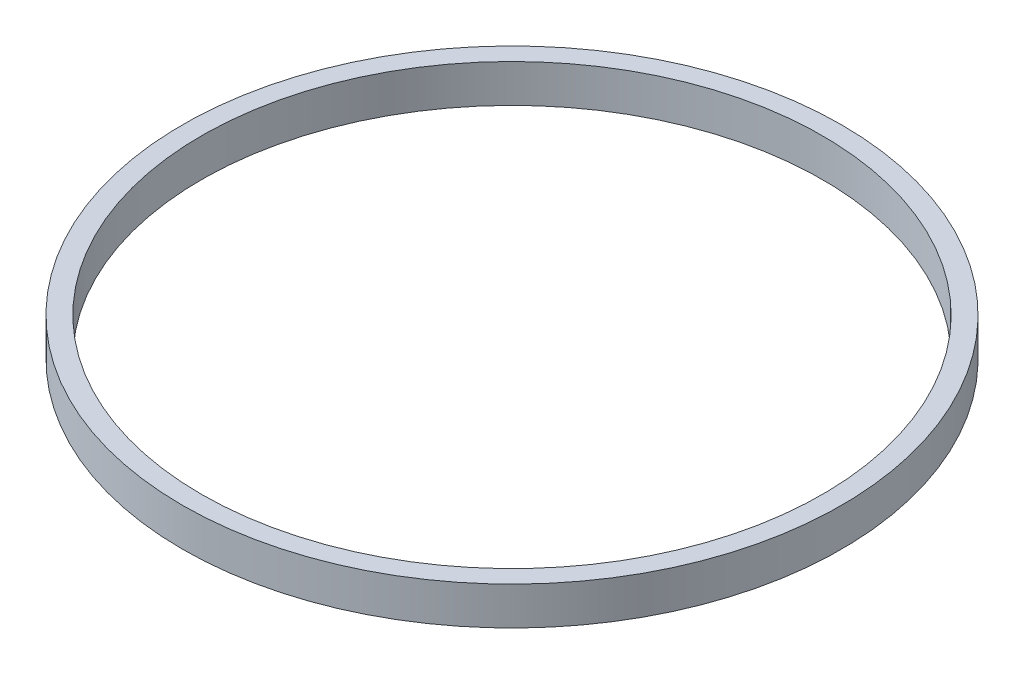
ISO-10303-21;
HEADER;
FILE_DESCRIPTION(('STEP AP214'),'2;1');
FILE_NAME('part.step','',(''),(''),'','','');
FILE_SCHEMA(('AUTOMOTIVE_DESIGN { 1 0 10303 214 1 1 1 1 }'));
ENDSEC;
DATA;
#1=APPLICATION_CONTEXT('core data for automotive mechanical design processes');
#2=APPLICATION_PROTOCOL_DEFINITION('international standard','automotive_design',2000,#1);
#3=PRODUCT_CONTEXT('',#1,'mechanical');
#4=PRODUCT('Part','Part','',(#3));
#5=PRODUCT_RELATED_PRODUCT_CATEGORY('part','',(#4));
#6=PRODUCT_DEFINITION_FORMATION('','',#4);
#7=PRODUCT_DEFINITION_CONTEXT('part definition',#1,'design');
#8=PRODUCT_DEFINITION('design','',#6,#7);
#9=PRODUCT_DEFINITION_SHAPE('','',#8);
#10=(LENGTH_UNIT() NAMED_UNIT(*) SI_UNIT(.MILLI.,.METRE.));
#11=(NAMED_UNIT(*) PLANE_ANGLE_UNIT() SI_UNIT($,.RADIAN.));
#12=(NAMED_UNIT(*) SI_UNIT($,.STERADIAN.) SOLID_ANGLE_UNIT());
#13=UNCERTAINTY_MEASURE_WITH_UNIT(LENGTH_MEASURE(1.E-05),#10,'distance_accuracy_value','');
#14=(GEOMETRIC_REPRESENTATION_CONTEXT(3) GLOBAL_UNCERTAINTY_ASSIGNED_CONTEXT((#13)) GLOBAL_UNIT_ASSIGNED_CONTEXT((#10,
#11,#12)) REPRESENTATION_CONTEXT('',''));
#15=CARTESIAN_POINT('',(0.,0.,0.));
#16=DIRECTION('',(0.,0.,1.));
#17=DIRECTION('',(1.,0.,0.));
#18=AXIS2_PLACEMENT_3D('',#15,#16,#17);
#19=CARTESIAN_POINT('',(0.,3.,0.));
#20=DIRECTION('',(0.,1.,0.));
#21=DIRECTION('',(0.,0.,1.));
#22=AXIS2_PLACEMENT_3D('',#19,#20,#21);
#23=PLANE('',#22);
#24=CARTESIAN_POINT('',(0.,3.,0.));
#25=DIRECTION('',(0.,1.,0.));
#26=DIRECTION('',(0.,0.,1.));
#27=AXIS2_PLACEMENT_3D('',#24,#25,#26);
#28=CIRCLE('',#27,26.);
#29=CARTESIAN_POINT('',(0.,3.,26.));
#30=VERTEX_POINT('',#29);
#31=EDGE_CURVE('E10',#30,#30,#28,.T.);
#32=ORIENTED_EDGE('',*,*,#31,.T.);
#33=EDGE_LOOP('',(#32));
#34=FACE_BOUND('',#33,.T.);
#35=CARTESIAN_POINT('',(0.,3.,0.));
#36=DIRECTION('',(0.,1.,0.));
#37=DIRECTION('',(0.,0.,1.));
#38=AXIS2_PLACEMENT_3D('',#35,#36,#37);
#39=CIRCLE('',#38,24.5);
#40=CARTESIAN_POINT('',(0.,3.,24.5));
#41=VERTEX_POINT('',#40);
#42=EDGE_CURVE('E43',#41,#41,#39,.T.);
#43=ORIENTED_EDGE('',*,*,#42,.F.);
#44=EDGE_LOOP('',(#43));
#45=FACE_BOUND('',#44,.T.);
#46=ADVANCED_FACE('F32',(#34,#45),#23,.T.);
#47=CARTESIAN_POINT('',(0.,0.,0.));
#48=DIRECTION('',(0.,1.,0.));
#49=DIRECTION('',(0.,0.,1.));
#50=AXIS2_PLACEMENT_3D('',#47,#48,#49);
#51=PLANE('',#50);
#52=CARTESIAN_POINT('',(0.,0.,0.));
#53=DIRECTION('',(0.,1.,0.));
#54=DIRECTION('',(0.,0.,1.));
#55=AXIS2_PLACEMENT_3D('',#52,#53,#54);
#56=CIRCLE('',#55,26.);
#57=CARTESIAN_POINT('',(0.,0.,26.));
#58=VERTEX_POINT('',#57);
#59=EDGE_CURVE('E36',#58,#58,#56,.T.);
#60=ORIENTED_EDGE('',*,*,#59,.F.);
#61=EDGE_LOOP('',(#60));
#62=FACE_BOUND('',#61,.T.);
#63=CARTESIAN_POINT('',(0.,0.,0.));
#64=DIRECTION('',(0.,1.,0.));
#65=DIRECTION('',(0.,0.,1.));
#66=AXIS2_PLACEMENT_3D('',#63,#64,#65);
#67=CIRCLE('',#66,24.5);
#68=CARTESIAN_POINT('',(0.,0.,24.5));
#69=VERTEX_POINT('',#68);
#70=EDGE_CURVE('E45',#69,#69,#67,.T.);
#71=ORIENTED_EDGE('',*,*,#70,.T.);
#72=EDGE_LOOP('',(#71));
#73=FACE_BOUND('',#72,.T.);
#74=ADVANCED_FACE('F55',(#62,#73),#51,.F.);
#75=CARTESIAN_POINT('',(0.,3.,0.));
#76=DIRECTION('',(0.,-1.,0.));
#77=DIRECTION('',(0.,0.,-1.));
#78=AXIS2_PLACEMENT_3D('',#75,#76,#77);
#79=CYLINDRICAL_SURFACE('',#78,26.);
#80=ORIENTED_EDGE('',*,*,#31,.F.);
#81=EDGE_LOOP('',(#80));
#82=FACE_BOUND('',#81,.T.);
#83=ORIENTED_EDGE('',*,*,#59,.T.);
#84=EDGE_LOOP('',(#83));
#85=FACE_BOUND('',#84,.T.);
#86=ADVANCED_FACE('F34',(#82,#85),#79,.T.);
#87=CARTESIAN_POINT('',(0.,3.,0.));
#88=DIRECTION('',(0.,-1.,0.));
#89=DIRECTION('',(0.,0.,-1.));
#90=AXIS2_PLACEMENT_3D('',#87,#88,#89);
#91=CYLINDRICAL_SURFACE('',#90,24.5);
#92=ORIENTED_EDGE('',*,*,#42,.T.);
#93=EDGE_LOOP('',(#92));
#94=FACE_BOUND('',#93,.T.);
#95=ORIENTED_EDGE('',*,*,#70,.F.);
#96=EDGE_LOOP('',(#95));
#97=FACE_BOUND('',#96,.T.);
#98=ADVANCED_FACE('F51',(#94,#97),#91,.F.);
#99=CLOSED_SHELL('',(#46,#74,#86,#98));
#100=MANIFOLD_SOLID_BREP('B2',#99);
#101=ADVANCED_BREP_SHAPE_REPRESENTATION('',(#18,#100),#14);
#102=SHAPE_DEFINITION_REPRESENTATION(#9,#101);
ENDSEC;
END-ISO-10303-21;
